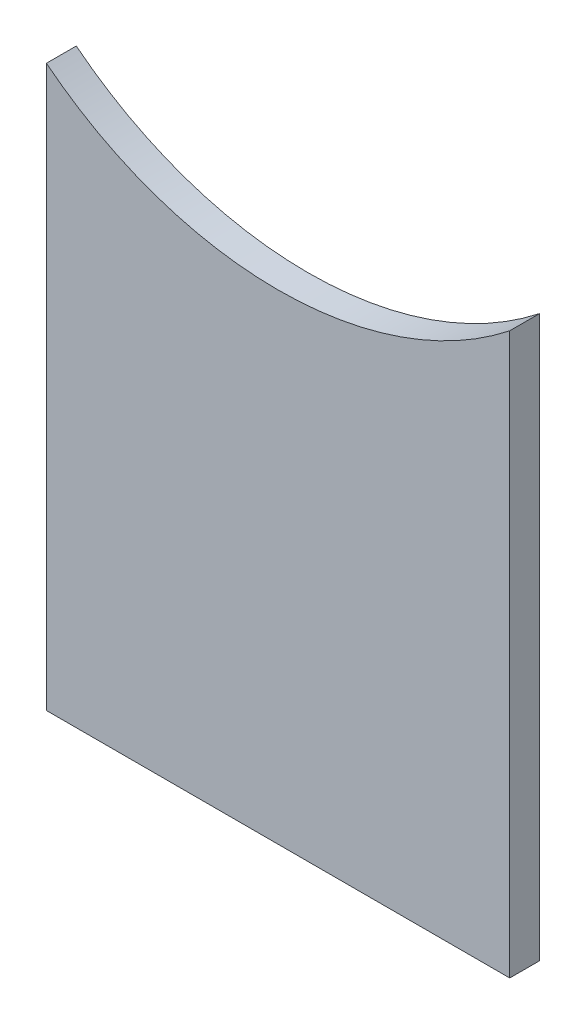
ISO-10303-21;
HEADER;
FILE_DESCRIPTION(('STEP AP214'),'2;1');
FILE_NAME('part.step','',(''),(''),'','','');
FILE_SCHEMA(('AUTOMOTIVE_DESIGN { 1 0 10303 214 1 1 1 1 }'));
ENDSEC;
DATA;
#1=APPLICATION_CONTEXT('core data for automotive mechanical design processes');
#2=APPLICATION_PROTOCOL_DEFINITION('international standard','automotive_design',2000,#1);
#3=PRODUCT_CONTEXT('',#1,'mechanical');
#4=PRODUCT('Part','Part','',(#3));
#5=PRODUCT_RELATED_PRODUCT_CATEGORY('part','',(#4));
#6=PRODUCT_DEFINITION_FORMATION('','',#4);
#7=PRODUCT_DEFINITION_CONTEXT('part definition',#1,'design');
#8=PRODUCT_DEFINITION('design','',#6,#7);
#9=PRODUCT_DEFINITION_SHAPE('','',#8);
#10=(LENGTH_UNIT() NAMED_UNIT(*) SI_UNIT(.MILLI.,.METRE.));
#11=(NAMED_UNIT(*) PLANE_ANGLE_UNIT() SI_UNIT($,.RADIAN.));
#12=(NAMED_UNIT(*) SI_UNIT($,.STERADIAN.) SOLID_ANGLE_UNIT());
#13=UNCERTAINTY_MEASURE_WITH_UNIT(LENGTH_MEASURE(1.E-05),#10,'distance_accuracy_value','');
#14=(GEOMETRIC_REPRESENTATION_CONTEXT(3) GLOBAL_UNCERTAINTY_ASSIGNED_CONTEXT((#13)) GLOBAL_UNIT_ASSIGNED_CONTEXT((#10,
#11,#12)) REPRESENTATION_CONTEXT('',''));
#15=CARTESIAN_POINT('',(0.,0.,0.));
#16=DIRECTION('',(0.,0.,1.));
#17=DIRECTION('',(1.,0.,0.));
#18=AXIS2_PLACEMENT_3D('',#15,#16,#17);
#19=CARTESIAN_POINT('',(31.1831361929538,-53.2038608822402,8.));
#20=DIRECTION('',(1.,0.,0.));
#21=DIRECTION('',(0.,0.,-1.));
#22=AXIS2_PLACEMENT_3D('',#19,#20,#21);
#23=PLANE('',#22);
#24=DIRECTION('',(0.,-1.,0.));
#25=VECTOR('',#24,1.);
#26=CARTESIAN_POINT('',(31.1831361929538,-53.2038608822402,0.));
#27=LINE('',#26,#25);
#28=CARTESIAN_POINT('',(31.1831361929537,96.7961391177599,0.));
#29=VERTEX_POINT('',#28);
#30=CARTESIAN_POINT('',(31.1831361929538,-53.2038608822402,0.));
#31=VERTEX_POINT('',#30);
#32=EDGE_CURVE('E98',#29,#31,#27,.T.);
#33=ORIENTED_EDGE('',*,*,#32,.T.);
#34=DIRECTION('',(0.,0.,-1.));
#35=VECTOR('',#34,1.);
#36=CARTESIAN_POINT('',(31.1831361929538,-53.2038608822402,8.));
#37=LINE('',#36,#35);
#38=CARTESIAN_POINT('',(31.1831361929538,-53.2038608822402,8.));
#39=VERTEX_POINT('',#38);
#40=EDGE_CURVE('E11',#39,#31,#37,.T.);
#41=ORIENTED_EDGE('',*,*,#40,.F.);
#42=DIRECTION('',(0.,-1.,0.));
#43=VECTOR('',#42,1.);
#44=CARTESIAN_POINT('',(31.1831361929538,-53.2038608822402,8.));
#45=LINE('',#44,#43);
#46=CARTESIAN_POINT('',(31.1831361929537,96.7961391177599,8.));
#47=VERTEX_POINT('',#46);
#48=EDGE_CURVE('E86',#47,#39,#45,.T.);
#49=ORIENTED_EDGE('',*,*,#48,.F.);
#50=DIRECTION('',(0.,0.,-1.));
#51=VECTOR('',#50,1.);
#52=CARTESIAN_POINT('',(31.1831361929537,96.7961391177599,8.));
#53=LINE('',#52,#51);
#54=EDGE_CURVE('E94',#47,#29,#53,.T.);
#55=ORIENTED_EDGE('',*,*,#54,.T.);
#56=EDGE_LOOP('',(#33,#41,#49,#55));
#57=FACE_BOUND('',#56,.T.);
#58=ADVANCED_FACE('F35',(#57),#23,.F.);
#59=CARTESIAN_POINT('',(31.1831361929538,-53.2038608822402,8.));
#60=DIRECTION('',(0.,1.,0.));
#61=DIRECTION('',(0.,0.,1.));
#62=AXIS2_PLACEMENT_3D('',#59,#60,#61);
#63=PLANE('',#62);
#64=DIRECTION('',(1.,0.,0.));
#65=VECTOR('',#64,1.);
#66=CARTESIAN_POINT('',(31.1831361929538,-53.2038608822402,0.));
#67=LINE('',#66,#65);
#68=CARTESIAN_POINT('',(155.183136192954,-53.2038608822402,0.));
#69=VERTEX_POINT('',#68);
#70=EDGE_CURVE('E90',#31,#69,#67,.T.);
#71=ORIENTED_EDGE('',*,*,#70,.T.);
#72=DIRECTION('',(0.,0.,-1.));
#73=VECTOR('',#72,1.);
#74=CARTESIAN_POINT('',(155.183136192954,-53.2038608822402,8.));
#75=LINE('',#74,#73);
#76=CARTESIAN_POINT('',(155.183136192954,-53.2038608822402,8.));
#77=VERTEX_POINT('',#76);
#78=EDGE_CURVE('E43',#77,#69,#75,.T.);
#79=ORIENTED_EDGE('',*,*,#78,.F.);
#80=DIRECTION('',(1.,0.,0.));
#81=VECTOR('',#80,1.);
#82=CARTESIAN_POINT('',(31.1831361929538,-53.2038608822402,8.));
#83=LINE('',#82,#81);
#84=EDGE_CURVE('E81',#39,#77,#83,.T.);
#85=ORIENTED_EDGE('',*,*,#84,.F.);
#86=ORIENTED_EDGE('',*,*,#40,.T.);
#87=EDGE_LOOP('',(#71,#79,#85,#86));
#88=FACE_BOUND('',#87,.T.);
#89=ADVANCED_FACE('F89',(#88),#63,.F.);
#90=CARTESIAN_POINT('',(155.183136192954,-53.2038608822402,8.));
#91=DIRECTION('',(-1.,0.,0.));
#92=DIRECTION('',(0.,0.,1.));
#93=AXIS2_PLACEMENT_3D('',#90,#91,#92);
#94=PLANE('',#93);
#95=DIRECTION('',(0.,1.,0.));
#96=VECTOR('',#95,1.);
#97=CARTESIAN_POINT('',(155.183136192954,-53.2038608822402,0.));
#98=LINE('',#97,#96);
#99=CARTESIAN_POINT('',(155.183136192954,96.7961391177598,0.));
#100=VERTEX_POINT('',#99);
#101=EDGE_CURVE('E68',#69,#100,#98,.T.);
#102=ORIENTED_EDGE('',*,*,#101,.T.);
#103=DIRECTION('',(0.,0.,-1.));
#104=VECTOR('',#103,1.);
#105=CARTESIAN_POINT('',(155.183136192954,96.7961391177598,8.));
#106=LINE('',#105,#104);
#107=CARTESIAN_POINT('',(155.183136192954,96.7961391177598,8.));
#108=VERTEX_POINT('',#107);
#109=EDGE_CURVE('E91',#108,#100,#106,.T.);
#110=ORIENTED_EDGE('',*,*,#109,.F.);
#111=DIRECTION('',(0.,1.,0.));
#112=VECTOR('',#111,1.);
#113=CARTESIAN_POINT('',(155.183136192954,-53.2038608822402,8.));
#114=LINE('',#113,#112);
#115=EDGE_CURVE('E84',#77,#108,#114,.T.);
#116=ORIENTED_EDGE('',*,*,#115,.F.);
#117=ORIENTED_EDGE('',*,*,#78,.T.);
#118=EDGE_LOOP('',(#102,#110,#116,#117));
#119=FACE_BOUND('',#118,.T.);
#120=ADVANCED_FACE('F92',(#119),#94,.F.);
#121=CARTESIAN_POINT('',(93.1831361929538,175.256320101492,8.));
#122=DIRECTION('',(0.,0.,-1.));
#123=DIRECTION('',(-1.,0.,0.));
#124=AXIS2_PLACEMENT_3D('',#121,#122,#123);
#125=CYLINDRICAL_SURFACE('',#124,100.);
#126=CARTESIAN_POINT('',(93.1831361929538,175.256320101492,0.));
#127=DIRECTION('',(0.,0.,-1.));
#128=DIRECTION('',(1.,0.,0.));
#129=AXIS2_PLACEMENT_3D('',#126,#127,#128);
#130=CIRCLE('',#129,100.);
#131=EDGE_CURVE('E74',#100,#29,#130,.T.);
#132=ORIENTED_EDGE('',*,*,#131,.T.);
#133=ORIENTED_EDGE('',*,*,#54,.F.);
#134=CARTESIAN_POINT('',(93.1831361929538,175.256320101492,8.));
#135=DIRECTION('',(0.,0.,-1.));
#136=DIRECTION('',(1.,0.,0.));
#137=AXIS2_PLACEMENT_3D('',#134,#135,#136);
#138=CIRCLE('',#137,100.);
#139=EDGE_CURVE('E51',#108,#47,#138,.T.);
#140=ORIENTED_EDGE('',*,*,#139,.F.);
#141=ORIENTED_EDGE('',*,*,#109,.T.);
#142=EDGE_LOOP('',(#132,#133,#140,#141));
#143=FACE_BOUND('',#142,.T.);
#144=ADVANCED_FACE('F105',(#143),#125,.F.);
#145=CARTESIAN_POINT('',(93.1831361929538,175.256320101492,8.));
#146=DIRECTION('',(0.,0.,1.));
#147=DIRECTION('',(1.,0.,0.));
#148=AXIS2_PLACEMENT_3D('',#145,#146,#147);
#149=PLANE('',#148);
#150=ORIENTED_EDGE('',*,*,#48,.T.);
#151=ORIENTED_EDGE('',*,*,#84,.T.);
#152=ORIENTED_EDGE('',*,*,#115,.T.);
#153=ORIENTED_EDGE('',*,*,#139,.T.);
#154=EDGE_LOOP('',(#150,#151,#152,#153));
#155=FACE_BOUND('',#154,.T.);
#156=ADVANCED_FACE('F82',(#155),#149,.T.);
#157=CARTESIAN_POINT('',(93.1831361929538,175.256320101492,0.));
#158=DIRECTION('',(0.,0.,1.));
#159=DIRECTION('',(1.,0.,0.));
#160=AXIS2_PLACEMENT_3D('',#157,#158,#159);
#161=PLANE('',#160);
#162=ORIENTED_EDGE('',*,*,#32,.F.);
#163=ORIENTED_EDGE('',*,*,#131,.F.);
#164=ORIENTED_EDGE('',*,*,#101,.F.);
#165=ORIENTED_EDGE('',*,*,#70,.F.);
#166=EDGE_LOOP('',(#162,#163,#164,#165));
#167=FACE_BOUND('',#166,.T.);
#168=ADVANCED_FACE('F108',(#167),#161,.F.);
#169=CLOSED_SHELL('',(#58,#89,#120,#144,#156,#168));
#170=MANIFOLD_SOLID_BREP('B2',#169);
#171=ADVANCED_BREP_SHAPE_REPRESENTATION('',(#18,#170),#14);
#172=SHAPE_DEFINITION_REPRESENTATION(#9,#171);
ENDSEC;
END-ISO-10303-21;
